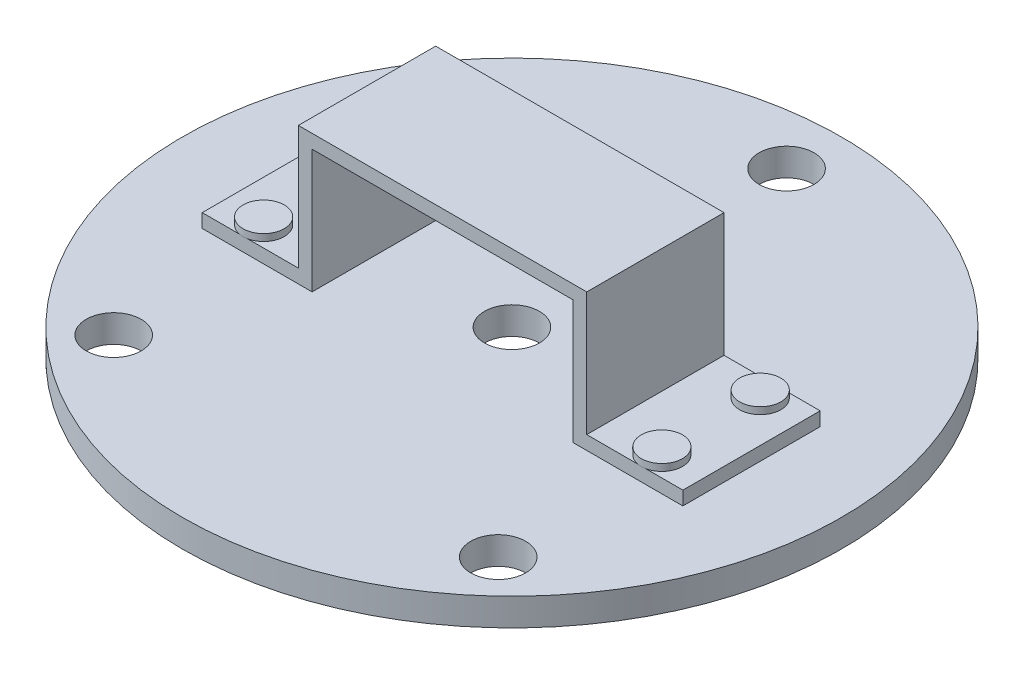
ISO-10303-21;
HEADER;
FILE_DESCRIPTION(('STEP AP214'),'2;1');
FILE_NAME('part.step','',(''),(''),'','','');
FILE_SCHEMA(('AUTOMOTIVE_DESIGN { 1 0 10303 214 1 1 1 1 }'));
ENDSEC;
DATA;
#1=APPLICATION_CONTEXT('core data for automotive mechanical design processes');
#2=APPLICATION_PROTOCOL_DEFINITION('international standard','automotive_design',2000,#1);
#3=PRODUCT_CONTEXT('',#1,'mechanical');
#4=PRODUCT('Part','Part','',(#3));
#5=PRODUCT_RELATED_PRODUCT_CATEGORY('part','',(#4));
#6=PRODUCT_DEFINITION_FORMATION('','',#4);
#7=PRODUCT_DEFINITION_CONTEXT('part definition',#1,'design');
#8=PRODUCT_DEFINITION('design','',#6,#7);
#9=PRODUCT_DEFINITION_SHAPE('','',#8);
#10=(LENGTH_UNIT() NAMED_UNIT(*) SI_UNIT(.MILLI.,.METRE.));
#11=(NAMED_UNIT(*) PLANE_ANGLE_UNIT() SI_UNIT($,.RADIAN.));
#12=(NAMED_UNIT(*) SI_UNIT($,.STERADIAN.) SOLID_ANGLE_UNIT());
#13=UNCERTAINTY_MEASURE_WITH_UNIT(LENGTH_MEASURE(1.E-05),#10,'distance_accuracy_value','');
#14=(GEOMETRIC_REPRESENTATION_CONTEXT(3) GLOBAL_UNCERTAINTY_ASSIGNED_CONTEXT((#13)) GLOBAL_UNIT_ASSIGNED_CONTEXT((#10,
#11,#12)) REPRESENTATION_CONTEXT('',''));
#15=CARTESIAN_POINT('',(0.,0.,0.));
#16=DIRECTION('',(0.,0.,1.));
#17=DIRECTION('',(1.,0.,0.));
#18=AXIS2_PLACEMENT_3D('',#15,#16,#17);
#19=CARTESIAN_POINT('',(0.,10.,0.));
#20=DIRECTION('',(0.,1.,0.));
#21=DIRECTION('',(0.,0.,1.));
#22=AXIS2_PLACEMENT_3D('',#19,#20,#21);
#23=PLANE('',#22);
#24=DIRECTION('',(-1.,0.,0.));
#25=VECTOR('',#24,1.);
#26=CARTESIAN_POINT('',(87.5,10.,25.2623733122565));
#27=LINE('',#26,#25);
#28=CARTESIAN_POINT('',(87.5,10.,25.2623733122565));
#29=VERTEX_POINT('',#28);
#30=CARTESIAN_POINT('',(47.5,10.,25.2623733122565));
#31=VERTEX_POINT('',#30);
#32=EDGE_CURVE('E310',#29,#31,#27,.T.);
#33=ORIENTED_EDGE('',*,*,#32,.T.);
#34=DIRECTION('',(0.,0.,-1.));
#35=VECTOR('',#34,1.);
#36=CARTESIAN_POINT('',(47.5,10.,25.2623733122565));
#37=LINE('',#36,#35);
#38=CARTESIAN_POINT('',(47.5,10.,-24.7376266877435));
#39=VERTEX_POINT('',#38);
#40=EDGE_CURVE('E284',#31,#39,#37,.T.);
#41=ORIENTED_EDGE('',*,*,#40,.T.);
#42=DIRECTION('',(1.,0.,0.));
#43=VECTOR('',#42,1.);
#44=CARTESIAN_POINT('',(87.5,10.,-24.7376266877435));
#45=LINE('',#44,#43);
#46=CARTESIAN_POINT('',(87.5,10.,-24.7376266877435));
#47=VERTEX_POINT('',#46);
#48=EDGE_CURVE('E317',#39,#47,#45,.T.);
#49=ORIENTED_EDGE('',*,*,#48,.T.);
#50=DIRECTION('',(0.,0.,1.));
#51=VECTOR('',#50,1.);
#52=CARTESIAN_POINT('',(87.5,10.,25.2623733122565));
#53=LINE('',#52,#51);
#54=EDGE_CURVE('E332',#47,#29,#53,.T.);
#55=ORIENTED_EDGE('',*,*,#54,.T.);
#56=EDGE_LOOP('',(#33,#41,#49,#55));
#57=FACE_BOUND('',#56,.T.);
#58=CARTESIAN_POINT('',(0.,10.,-100.));
#59=DIRECTION('',(0.,1.,0.));
#60=DIRECTION('',(0.,0.,1.));
#61=AXIS2_PLACEMENT_3D('',#58,#59,#60);
#62=CIRCLE('',#61,10.);
#63=CARTESIAN_POINT('',(0.,10.,-90.));
#64=VERTEX_POINT('',#63);
#65=EDGE_CURVE('E382',#64,#64,#62,.T.);
#66=ORIENTED_EDGE('',*,*,#65,.F.);
#67=EDGE_LOOP('',(#66));
#68=FACE_BOUND('',#67,.T.);
#69=CARTESIAN_POINT('',(-70.,10.,75.));
#70=DIRECTION('',(0.,1.,0.));
#71=DIRECTION('',(0.,0.,1.));
#72=AXIS2_PLACEMENT_3D('',#69,#70,#71);
#73=CIRCLE('',#72,10.);
#74=CARTESIAN_POINT('',(-70.,10.,85.));
#75=VERTEX_POINT('',#74);
#76=EDGE_CURVE('E390',#75,#75,#73,.T.);
#77=ORIENTED_EDGE('',*,*,#76,.F.);
#78=EDGE_LOOP('',(#77));
#79=FACE_BOUND('',#78,.T.);
#80=CARTESIAN_POINT('',(70.,10.,75.));
#81=DIRECTION('',(0.,1.,0.));
#82=DIRECTION('',(0.,0.,-1.));
#83=AXIS2_PLACEMENT_3D('',#80,#81,#82);
#84=CIRCLE('',#83,10.);
#85=CARTESIAN_POINT('',(70.,10.,65.));
#86=VERTEX_POINT('',#85);
#87=EDGE_CURVE('E376',#86,#86,#84,.T.);
#88=ORIENTED_EDGE('',*,*,#87,.F.);
#89=EDGE_LOOP('',(#88));
#90=FACE_BOUND('',#89,.T.);
#91=CARTESIAN_POINT('',(0.,10.,0.));
#92=DIRECTION('',(0.,1.,0.));
#93=DIRECTION('',(0.,0.,1.));
#94=AXIS2_PLACEMENT_3D('',#91,#92,#93);
#95=CIRCLE('',#94,10.);
#96=CARTESIAN_POINT('',(0.,10.,10.));
#97=VERTEX_POINT('',#96);
#98=EDGE_CURVE('E404',#97,#97,#95,.T.);
#99=ORIENTED_EDGE('',*,*,#98,.F.);
#100=EDGE_LOOP('',(#99));
#101=FACE_BOUND('',#100,.T.);
#102=CARTESIAN_POINT('',(0.,10.,0.));
#103=DIRECTION('',(0.,1.,0.));
#104=DIRECTION('',(0.,0.,1.));
#105=AXIS2_PLACEMENT_3D('',#102,#103,#104);
#106=CIRCLE('',#105,120.);
#107=CARTESIAN_POINT('',(0.,10.,120.));
#108=VERTEX_POINT('',#107);
#109=EDGE_CURVE('E11',#108,#108,#106,.T.);
#110=ORIENTED_EDGE('',*,*,#109,.T.);
#111=EDGE_LOOP('',(#110));
#112=FACE_BOUND('',#111,.T.);
#113=DIRECTION('',(0.,0.,-1.));
#114=VECTOR('',#113,1.);
#115=CARTESIAN_POINT('',(-47.5,10.,25.2623733122565));
#116=LINE('',#115,#114);
#117=CARTESIAN_POINT('',(-47.5,10.,25.2623733122565));
#118=VERTEX_POINT('',#117);
#119=CARTESIAN_POINT('',(-47.5,10.,-24.7376266877435));
#120=VERTEX_POINT('',#119);
#121=EDGE_CURVE('E297',#118,#120,#116,.T.);
#122=ORIENTED_EDGE('',*,*,#121,.F.);
#123=DIRECTION('',(1.,0.,0.));
#124=VECTOR('',#123,1.);
#125=CARTESIAN_POINT('',(-87.5,10.,25.2623733122565));
#126=LINE('',#125,#124);
#127=CARTESIAN_POINT('',(-87.5,10.,25.2623733122565));
#128=VERTEX_POINT('',#127);
#129=EDGE_CURVE('E350',#128,#118,#126,.T.);
#130=ORIENTED_EDGE('',*,*,#129,.F.);
#131=DIRECTION('',(0.,0.,1.));
#132=VECTOR('',#131,1.);
#133=CARTESIAN_POINT('',(-87.5,10.,25.2623733122565));
#134=LINE('',#133,#132);
#135=CARTESIAN_POINT('',(-87.5,10.,-24.7376266877435));
#136=VERTEX_POINT('',#135);
#137=EDGE_CURVE('E364',#136,#128,#134,.T.);
#138=ORIENTED_EDGE('',*,*,#137,.F.);
#139=DIRECTION('',(-1.,0.,0.));
#140=VECTOR('',#139,1.);
#141=CARTESIAN_POINT('',(-87.5,10.,-24.7376266877435));
#142=LINE('',#141,#140);
#143=EDGE_CURVE('E344',#120,#136,#142,.T.);
#144=ORIENTED_EDGE('',*,*,#143,.F.);
#145=EDGE_LOOP('',(#122,#130,#138,#144));
#146=FACE_BOUND('',#145,.T.);
#147=ADVANCED_FACE('F41',(#57,#68,#79,#90,#101,#112,#146),#23,.T.);
#148=CARTESIAN_POINT('',(0.,10.,0.));
#149=DIRECTION('',(0.,-1.,0.));
#150=DIRECTION('',(0.,0.,-1.));
#151=AXIS2_PLACEMENT_3D('',#148,#149,#150);
#152=CYLINDRICAL_SURFACE('',#151,120.);
#153=ORIENTED_EDGE('',*,*,#109,.F.);
#154=EDGE_LOOP('',(#153));
#155=FACE_BOUND('',#154,.T.);
#156=CARTESIAN_POINT('',(0.,0.,0.));
#157=DIRECTION('',(0.,1.,0.));
#158=DIRECTION('',(0.,0.,1.));
#159=AXIS2_PLACEMENT_3D('',#156,#157,#158);
#160=CIRCLE('',#159,120.);
#161=CARTESIAN_POINT('',(0.,0.,120.));
#162=VERTEX_POINT('',#161);
#163=EDGE_CURVE('E51',#162,#162,#160,.T.);
#164=ORIENTED_EDGE('',*,*,#163,.T.);
#165=EDGE_LOOP('',(#164));
#166=FACE_BOUND('',#165,.T.);
#167=ADVANCED_FACE('F43',(#155,#166),#152,.T.);
#168=CARTESIAN_POINT('',(0.,0.,0.));
#169=DIRECTION('',(0.,1.,0.));
#170=DIRECTION('',(0.,0.,1.));
#171=AXIS2_PLACEMENT_3D('',#168,#169,#170);
#172=PLANE('',#171);
#173=CARTESIAN_POINT('',(72.5,0.,-17.9048537648717));
#174=DIRECTION('',(0.,-1.,0.));
#175=DIRECTION('',(0.,0.,1.));
#176=AXIS2_PLACEMENT_3D('',#173,#174,#175);
#177=CIRCLE('',#176,5.);
#178=CARTESIAN_POINT('',(72.5,0.,-12.9048537648717));
#179=VERTEX_POINT('',#178);
#180=EDGE_CURVE('E230',#179,#179,#177,.T.);
#181=ORIENTED_EDGE('',*,*,#180,.F.);
#182=EDGE_LOOP('',(#181));
#183=FACE_BOUND('',#182,.T.);
#184=CARTESIAN_POINT('',(72.5,0.,16.9706874814871));
#185=DIRECTION('',(0.,-1.,0.));
#186=DIRECTION('',(0.,0.,1.));
#187=AXIS2_PLACEMENT_3D('',#184,#185,#186);
#188=CIRCLE('',#187,5.);
#189=CARTESIAN_POINT('',(72.5,0.,21.9706874814871));
#190=VERTEX_POINT('',#189);
#191=EDGE_CURVE('E229',#190,#190,#188,.T.);
#192=ORIENTED_EDGE('',*,*,#191,.F.);
#193=EDGE_LOOP('',(#192));
#194=FACE_BOUND('',#193,.T.);
#195=CARTESIAN_POINT('',(-72.5,0.,-17.9048537648717));
#196=DIRECTION('',(0.,1.,0.));
#197=DIRECTION('',(0.,0.,1.));
#198=AXIS2_PLACEMENT_3D('',#195,#196,#197);
#199=CIRCLE('',#198,5.);
#200=CARTESIAN_POINT('',(-72.5,0.,-12.9048537648717));
#201=VERTEX_POINT('',#200);
#202=EDGE_CURVE('E238',#201,#201,#199,.T.);
#203=ORIENTED_EDGE('',*,*,#202,.T.);
#204=EDGE_LOOP('',(#203));
#205=FACE_BOUND('',#204,.T.);
#206=CARTESIAN_POINT('',(-72.5,0.,16.9706874814871));
#207=DIRECTION('',(0.,1.,0.));
#208=DIRECTION('',(0.,0.,1.));
#209=AXIS2_PLACEMENT_3D('',#206,#207,#208);
#210=CIRCLE('',#209,5.);
#211=CARTESIAN_POINT('',(-72.5,0.,21.9706874814871));
#212=VERTEX_POINT('',#211);
#213=EDGE_CURVE('E234',#212,#212,#210,.T.);
#214=ORIENTED_EDGE('',*,*,#213,.T.);
#215=EDGE_LOOP('',(#214));
#216=FACE_BOUND('',#215,.T.);
#217=CARTESIAN_POINT('',(0.,0.,-100.));
#218=DIRECTION('',(0.,1.,0.));
#219=DIRECTION('',(0.,0.,1.));
#220=AXIS2_PLACEMENT_3D('',#217,#218,#219);
#221=CIRCLE('',#220,10.);
#222=CARTESIAN_POINT('',(0.,0.,-90.));
#223=VERTEX_POINT('',#222);
#224=EDGE_CURVE('E377',#223,#223,#221,.T.);
#225=ORIENTED_EDGE('',*,*,#224,.T.);
#226=EDGE_LOOP('',(#225));
#227=FACE_BOUND('',#226,.T.);
#228=CARTESIAN_POINT('',(-70.,0.,75.));
#229=DIRECTION('',(0.,1.,0.));
#230=DIRECTION('',(0.,0.,1.));
#231=AXIS2_PLACEMENT_3D('',#228,#229,#230);
#232=CIRCLE('',#231,10.);
#233=CARTESIAN_POINT('',(-70.,0.,85.));
#234=VERTEX_POINT('',#233);
#235=EDGE_CURVE('E386',#234,#234,#232,.T.);
#236=ORIENTED_EDGE('',*,*,#235,.T.);
#237=EDGE_LOOP('',(#236));
#238=FACE_BOUND('',#237,.T.);
#239=CARTESIAN_POINT('',(70.,0.,75.));
#240=DIRECTION('',(0.,1.,0.));
#241=DIRECTION('',(0.,0.,-1.));
#242=AXIS2_PLACEMENT_3D('',#239,#240,#241);
#243=CIRCLE('',#242,10.);
#244=CARTESIAN_POINT('',(70.,0.,65.));
#245=VERTEX_POINT('',#244);
#246=EDGE_CURVE('E394',#245,#245,#243,.T.);
#247=ORIENTED_EDGE('',*,*,#246,.T.);
#248=EDGE_LOOP('',(#247));
#249=FACE_BOUND('',#248,.T.);
#250=CARTESIAN_POINT('',(0.,0.,0.));
#251=DIRECTION('',(0.,1.,0.));
#252=DIRECTION('',(0.,0.,1.));
#253=AXIS2_PLACEMENT_3D('',#250,#251,#252);
#254=CIRCLE('',#253,10.);
#255=CARTESIAN_POINT('',(0.,0.,10.));
#256=VERTEX_POINT('',#255);
#257=EDGE_CURVE('E381',#256,#256,#254,.T.);
#258=ORIENTED_EDGE('',*,*,#257,.T.);
#259=EDGE_LOOP('',(#258));
#260=FACE_BOUND('',#259,.T.);
#261=ORIENTED_EDGE('',*,*,#163,.F.);
#262=EDGE_LOOP('',(#261));
#263=FACE_BOUND('',#262,.T.);
#264=ADVANCED_FACE('F445',(#183,#194,#205,#216,#227,#238,#249,#260,#263),#172,.F.);
#265=CARTESIAN_POINT('',(0.,0.,0.));
#266=DIRECTION('',(0.,1.,0.));
#267=DIRECTION('',(0.,0.,1.));
#268=AXIS2_PLACEMENT_3D('',#265,#266,#267);
#269=CYLINDRICAL_SURFACE('',#268,10.);
#270=ORIENTED_EDGE('',*,*,#98,.T.);
#271=EDGE_LOOP('',(#270));
#272=FACE_BOUND('',#271,.T.);
#273=ORIENTED_EDGE('',*,*,#257,.F.);
#274=EDGE_LOOP('',(#273));
#275=FACE_BOUND('',#274,.T.);
#276=ADVANCED_FACE('F449',(#272,#275),#269,.F.);
#277=CARTESIAN_POINT('',(70.,0.,75.));
#278=DIRECTION('',(0.,1.,0.));
#279=DIRECTION('',(0.,0.,1.));
#280=AXIS2_PLACEMENT_3D('',#277,#278,#279);
#281=CYLINDRICAL_SURFACE('',#280,10.);
#282=ORIENTED_EDGE('',*,*,#246,.F.);
#283=EDGE_LOOP('',(#282));
#284=FACE_BOUND('',#283,.T.);
#285=ORIENTED_EDGE('',*,*,#87,.T.);
#286=EDGE_LOOP('',(#285));
#287=FACE_BOUND('',#286,.T.);
#288=ADVANCED_FACE('F457',(#284,#287),#281,.F.);
#289=CARTESIAN_POINT('',(-70.,0.,75.));
#290=DIRECTION('',(0.,1.,0.));
#291=DIRECTION('',(0.,0.,1.));
#292=AXIS2_PLACEMENT_3D('',#289,#290,#291);
#293=CYLINDRICAL_SURFACE('',#292,10.);
#294=ORIENTED_EDGE('',*,*,#235,.F.);
#295=EDGE_LOOP('',(#294));
#296=FACE_BOUND('',#295,.T.);
#297=ORIENTED_EDGE('',*,*,#76,.T.);
#298=EDGE_LOOP('',(#297));
#299=FACE_BOUND('',#298,.T.);
#300=ADVANCED_FACE('F480',(#296,#299),#293,.F.);
#301=CARTESIAN_POINT('',(0.,0.,-100.));
#302=DIRECTION('',(0.,1.,0.));
#303=DIRECTION('',(0.,0.,1.));
#304=AXIS2_PLACEMENT_3D('',#301,#302,#303);
#305=CYLINDRICAL_SURFACE('',#304,10.);
#306=ORIENTED_EDGE('',*,*,#224,.F.);
#307=EDGE_LOOP('',(#306));
#308=FACE_BOUND('',#307,.T.);
#309=ORIENTED_EDGE('',*,*,#65,.T.);
#310=EDGE_LOOP('',(#309));
#311=FACE_BOUND('',#310,.T.);
#312=ADVANCED_FACE('F574',(#308,#311),#305,.F.);
#313=CARTESIAN_POINT('',(-87.5,15.,-24.7376266877435));
#314=DIRECTION('',(0.,0.,1.));
#315=DIRECTION('',(1.,0.,0.));
#316=AXIS2_PLACEMENT_3D('',#313,#314,#315);
#317=PLANE('',#316);
#318=ORIENTED_EDGE('',*,*,#143,.T.);
#319=DIRECTION('',(0.,-1.,0.));
#320=VECTOR('',#319,1.);
#321=CARTESIAN_POINT('',(-87.5,15.,-24.7376266877435));
#322=LINE('',#321,#320);
#323=CARTESIAN_POINT('',(-87.5,15.,-24.7376266877435));
#324=VERTEX_POINT('',#323);
#325=EDGE_CURVE('E372',#324,#136,#322,.T.);
#326=ORIENTED_EDGE('',*,*,#325,.F.);
#327=DIRECTION('',(-1.,0.,0.));
#328=VECTOR('',#327,1.);
#329=CARTESIAN_POINT('',(-87.5,15.,-24.7376266877435));
#330=LINE('',#329,#328);
#331=CARTESIAN_POINT('',(-75.5924446938418,15.,-24.7376266877435));
#332=VERTEX_POINT('',#331);
#333=EDGE_CURVE('E349',#332,#324,#330,.T.);
#334=ORIENTED_EDGE('',*,*,#333,.F.);
#335=DIRECTION('',(-1.,0.,0.));
#336=VECTOR('',#335,1.);
#337=CARTESIAN_POINT('',(-87.5,15.,-24.7376266877435));
#338=LINE('',#337,#336);
#339=CARTESIAN_POINT('',(-69.4075553061582,15.,-24.7376266877435));
#340=VERTEX_POINT('',#339);
#341=EDGE_CURVE('E221',#340,#332,#338,.T.);
#342=ORIENTED_EDGE('',*,*,#341,.F.);
#343=CARTESIAN_POINT('',(-52.5,15.,-24.7376266877435));
#344=VERTEX_POINT('',#343);
#345=EDGE_CURVE('E351',#344,#340,#330,.T.);
#346=ORIENTED_EDGE('',*,*,#345,.F.);
#347=DIRECTION('',(0.,1.,0.));
#348=VECTOR('',#347,1.);
#349=CARTESIAN_POINT('',(-52.5,10.,-24.7376266877435));
#350=LINE('',#349,#348);
#351=CARTESIAN_POINT('',(-52.5,60.,-24.7376266877435));
#352=VERTEX_POINT('',#351);
#353=EDGE_CURVE('E298',#344,#352,#350,.T.);
#354=ORIENTED_EDGE('',*,*,#353,.T.);
#355=DIRECTION('',(-1.,0.,0.));
#356=VECTOR('',#355,1.);
#357=CARTESIAN_POINT('',(-52.5,60.,-24.7376266877435));
#358=LINE('',#357,#356);
#359=CARTESIAN_POINT('',(52.5,60.,-24.7376266877435));
#360=VERTEX_POINT('',#359);
#361=EDGE_CURVE('E259',#360,#352,#358,.T.);
#362=ORIENTED_EDGE('',*,*,#361,.F.);
#363=DIRECTION('',(0.,1.,0.));
#364=VECTOR('',#363,1.);
#365=CARTESIAN_POINT('',(52.5,10.,-24.7376266877435));
#366=LINE('',#365,#364);
#367=CARTESIAN_POINT('',(52.5,15.,-24.7376266877435));
#368=VERTEX_POINT('',#367);
#369=EDGE_CURVE('E276',#368,#360,#366,.T.);
#370=ORIENTED_EDGE('',*,*,#369,.F.);
#371=DIRECTION('',(1.,0.,0.));
#372=VECTOR('',#371,1.);
#373=CARTESIAN_POINT('',(87.5,15.,-24.7376266877435));
#374=LINE('',#373,#372);
#375=CARTESIAN_POINT('',(69.4075553061582,15.,-24.7376266877435));
#376=VERTEX_POINT('',#375);
#377=EDGE_CURVE('E325',#368,#376,#374,.T.);
#378=ORIENTED_EDGE('',*,*,#377,.T.);
#379=DIRECTION('',(-1.,0.,0.));
#380=VECTOR('',#379,1.);
#381=CARTESIAN_POINT('',(-87.5,15.,-24.7376266877435));
#382=LINE('',#381,#380);
#383=CARTESIAN_POINT('',(75.5924446938418,15.,-24.7376266877435));
#384=VERTEX_POINT('',#383);
#385=EDGE_CURVE('E200',#384,#376,#382,.T.);
#386=ORIENTED_EDGE('',*,*,#385,.F.);
#387=CARTESIAN_POINT('',(87.5,15.,-24.7376266877435));
#388=VERTEX_POINT('',#387);
#389=EDGE_CURVE('E324',#384,#388,#374,.T.);
#390=ORIENTED_EDGE('',*,*,#389,.T.);
#391=DIRECTION('',(0.,-1.,0.));
#392=VECTOR('',#391,1.);
#393=CARTESIAN_POINT('',(87.5,15.,-24.7376266877435));
#394=LINE('',#393,#392);
#395=EDGE_CURVE('E329',#388,#47,#394,.T.);
#396=ORIENTED_EDGE('',*,*,#395,.T.);
#397=ORIENTED_EDGE('',*,*,#48,.F.);
#398=DIRECTION('',(0.,1.,0.));
#399=VECTOR('',#398,1.);
#400=CARTESIAN_POINT('',(47.5,10.,-24.7376266877435));
#401=LINE('',#400,#399);
#402=CARTESIAN_POINT('',(47.5,55.,-24.7376266877435));
#403=VERTEX_POINT('',#402);
#404=EDGE_CURVE('E280',#39,#403,#401,.T.);
#405=ORIENTED_EDGE('',*,*,#404,.T.);
#406=DIRECTION('',(-1.,0.,0.));
#407=VECTOR('',#406,1.);
#408=CARTESIAN_POINT('',(-52.5,55.,-24.7376266877435));
#409=LINE('',#408,#407);
#410=CARTESIAN_POINT('',(-47.5,55.,-24.7376266877435));
#411=VERTEX_POINT('',#410);
#412=EDGE_CURVE('E251',#403,#411,#409,.T.);
#413=ORIENTED_EDGE('',*,*,#412,.T.);
#414=DIRECTION('',(0.,1.,0.));
#415=VECTOR('',#414,1.);
#416=CARTESIAN_POINT('',(-47.5,10.,-24.7376266877435));
#417=LINE('',#416,#415);
#418=EDGE_CURVE('E302',#120,#411,#417,.T.);
#419=ORIENTED_EDGE('',*,*,#418,.F.);
#420=EDGE_LOOP('',(#318,#326,#334,#342,#346,#354,#362,#370,#378,#386,#390,#396,#397,#405,#413,#419));
#421=FACE_BOUND('',#420,.T.);
#422=ADVANCED_FACE('F496',(#421),#317,.F.);
#423=CARTESIAN_POINT('',(-87.5,15.,25.2623733122565));
#424=DIRECTION('',(1.,0.,0.));
#425=DIRECTION('',(0.,0.,-1.));
#426=AXIS2_PLACEMENT_3D('',#423,#424,#425);
#427=PLANE('',#426);
#428=ORIENTED_EDGE('',*,*,#137,.T.);
#429=DIRECTION('',(0.,-1.,0.));
#430=VECTOR('',#429,1.);
#431=CARTESIAN_POINT('',(-87.5,15.,25.2623733122565));
#432=LINE('',#431,#430);
#433=CARTESIAN_POINT('',(-87.5,15.,25.2623733122565));
#434=VERTEX_POINT('',#433);
#435=EDGE_CURVE('E361',#434,#128,#432,.T.);
#436=ORIENTED_EDGE('',*,*,#435,.F.);
#437=DIRECTION('',(0.,0.,1.));
#438=VECTOR('',#437,1.);
#439=CARTESIAN_POINT('',(-87.5,15.,25.2623733122565));
#440=LINE('',#439,#438);
#441=EDGE_CURVE('E354',#324,#434,#440,.T.);
#442=ORIENTED_EDGE('',*,*,#441,.F.);
#443=ORIENTED_EDGE('',*,*,#325,.T.);
#444=EDGE_LOOP('',(#428,#436,#442,#443));
#445=FACE_BOUND('',#444,.T.);
#446=ADVANCED_FACE('F506',(#445),#427,.F.);
#447=CARTESIAN_POINT('',(-87.5,15.,25.2623733122565));
#448=DIRECTION('',(0.,0.,-1.));
#449=DIRECTION('',(-1.,0.,0.));
#450=AXIS2_PLACEMENT_3D('',#447,#448,#449);
#451=PLANE('',#450);
#452=ORIENTED_EDGE('',*,*,#129,.T.);
#453=DIRECTION('',(0.,-1.,0.));
#454=VECTOR('',#453,1.);
#455=CARTESIAN_POINT('',(-47.5,10.,25.2623733122565));
#456=LINE('',#455,#454);
#457=CARTESIAN_POINT('',(-47.5,55.,25.2623733122565));
#458=VERTEX_POINT('',#457);
#459=EDGE_CURVE('E293',#458,#118,#456,.T.);
#460=ORIENTED_EDGE('',*,*,#459,.F.);
#461=DIRECTION('',(1.,0.,0.));
#462=VECTOR('',#461,1.);
#463=CARTESIAN_POINT('',(-52.5,55.,25.2623733122565));
#464=LINE('',#463,#462);
#465=CARTESIAN_POINT('',(47.5,55.,25.2623733122565));
#466=VERTEX_POINT('',#465);
#467=EDGE_CURVE('E264',#458,#466,#464,.T.);
#468=ORIENTED_EDGE('',*,*,#467,.T.);
#469=DIRECTION('',(0.,-1.,0.));
#470=VECTOR('',#469,1.);
#471=CARTESIAN_POINT('',(47.5,10.,25.2623733122565));
#472=LINE('',#471,#470);
#473=EDGE_CURVE('E271',#466,#31,#472,.T.);
#474=ORIENTED_EDGE('',*,*,#473,.T.);
#475=ORIENTED_EDGE('',*,*,#32,.F.);
#476=DIRECTION('',(0.,-1.,0.));
#477=VECTOR('',#476,1.);
#478=CARTESIAN_POINT('',(87.5,15.,25.2623733122565));
#479=LINE('',#478,#477);
#480=CARTESIAN_POINT('',(87.5,15.,25.2623733122565));
#481=VERTEX_POINT('',#480);
#482=EDGE_CURVE('E340',#481,#29,#479,.T.);
#483=ORIENTED_EDGE('',*,*,#482,.F.);
#484=DIRECTION('',(-1.,0.,0.));
#485=VECTOR('',#484,1.);
#486=CARTESIAN_POINT('',(87.5,15.,25.2623733122565));
#487=LINE('',#486,#485);
#488=CARTESIAN_POINT('',(73.9549591437053,15.,25.2623733122565));
#489=VERTEX_POINT('',#488);
#490=EDGE_CURVE('E177',#481,#489,#487,.T.);
#491=ORIENTED_EDGE('',*,*,#490,.T.);
#492=DIRECTION('',(-1.,0.,0.));
#493=VECTOR('',#492,1.);
#494=CARTESIAN_POINT('',(-87.5,15.,25.2623733122565));
#495=LINE('',#494,#493);
#496=CARTESIAN_POINT('',(71.0450408562947,15.,25.2623733122565));
#497=VERTEX_POINT('',#496);
#498=EDGE_CURVE('E166',#489,#497,#495,.T.);
#499=ORIENTED_EDGE('',*,*,#498,.T.);
#500=CARTESIAN_POINT('',(52.5,15.,25.2623733122565));
#501=VERTEX_POINT('',#500);
#502=EDGE_CURVE('E170',#497,#501,#487,.T.);
#503=ORIENTED_EDGE('',*,*,#502,.T.);
#504=DIRECTION('',(0.,-1.,0.));
#505=VECTOR('',#504,1.);
#506=CARTESIAN_POINT('',(52.5,10.,25.2623733122565));
#507=LINE('',#506,#505);
#508=CARTESIAN_POINT('',(52.5,60.,25.2623733122565));
#509=VERTEX_POINT('',#508);
#510=EDGE_CURVE('E263',#509,#501,#507,.T.);
#511=ORIENTED_EDGE('',*,*,#510,.F.);
#512=DIRECTION('',(1.,0.,0.));
#513=VECTOR('',#512,1.);
#514=CARTESIAN_POINT('',(-52.5,60.,25.2623733122565));
#515=LINE('',#514,#513);
#516=CARTESIAN_POINT('',(-52.5,60.,25.2623733122565));
#517=VERTEX_POINT('',#516);
#518=EDGE_CURVE('E250',#517,#509,#515,.T.);
#519=ORIENTED_EDGE('',*,*,#518,.F.);
#520=DIRECTION('',(0.,-1.,0.));
#521=VECTOR('',#520,1.);
#522=CARTESIAN_POINT('',(-52.5,10.,25.2623733122565));
#523=LINE('',#522,#521);
#524=CARTESIAN_POINT('',(-52.5,15.,25.2623733122565));
#525=VERTEX_POINT('',#524);
#526=EDGE_CURVE('E288',#517,#525,#523,.T.);
#527=ORIENTED_EDGE('',*,*,#526,.T.);
#528=DIRECTION('',(1.,0.,0.));
#529=VECTOR('',#528,1.);
#530=CARTESIAN_POINT('',(-87.5,15.,25.2623733122565));
#531=LINE('',#530,#529);
#532=CARTESIAN_POINT('',(-71.0450408562947,15.,25.2623733122565));
#533=VERTEX_POINT('',#532);
#534=EDGE_CURVE('E357',#533,#525,#531,.T.);
#535=ORIENTED_EDGE('',*,*,#534,.F.);
#536=DIRECTION('',(-1.,0.,0.));
#537=VECTOR('',#536,1.);
#538=CARTESIAN_POINT('',(-87.5,15.,25.2623733122565));
#539=LINE('',#538,#537);
#540=CARTESIAN_POINT('',(-73.9549591437053,15.,25.2623733122565));
#541=VERTEX_POINT('',#540);
#542=EDGE_CURVE('E208',#533,#541,#539,.T.);
#543=ORIENTED_EDGE('',*,*,#542,.T.);
#544=EDGE_CURVE('E358',#434,#541,#531,.T.);
#545=ORIENTED_EDGE('',*,*,#544,.F.);
#546=ORIENTED_EDGE('',*,*,#435,.T.);
#547=EDGE_LOOP('',(#452,#460,#468,#474,#475,#483,#491,#499,#503,#511,#519,#527,#535,#543,#545,#546));
#548=FACE_BOUND('',#547,.T.);
#549=ADVANCED_FACE('F179',(#548),#451,.F.);
#550=CARTESIAN_POINT('',(0.,15.,0.));
#551=DIRECTION('',(0.,-1.,0.));
#552=DIRECTION('',(0.,0.,-1.));
#553=AXIS2_PLACEMENT_3D('',#550,#551,#552);
#554=PLANE('',#553);
#555=CARTESIAN_POINT('',(-72.5,15.,17.9048537648717));
#556=DIRECTION('',(0.,1.,0.));
#557=DIRECTION('',(0.,0.,-1.));
#558=AXIS2_PLACEMENT_3D('',#555,#556,#557);
#559=CIRCLE('',#558,7.50000000000001);
#560=EDGE_CURVE('E203',#533,#541,#559,.T.);
#561=ORIENTED_EDGE('',*,*,#560,.F.);
#562=ORIENTED_EDGE('',*,*,#534,.T.);
#563=DIRECTION('',(0.,0.,-1.));
#564=VECTOR('',#563,1.);
#565=CARTESIAN_POINT('',(-52.5,15.,25.2623733122565));
#566=LINE('',#565,#564);
#567=EDGE_CURVE('E345',#525,#344,#566,.T.);
#568=ORIENTED_EDGE('',*,*,#567,.T.);
#569=ORIENTED_EDGE('',*,*,#345,.T.);
#570=CARTESIAN_POINT('',(-72.5,15.,-17.9048537648717));
#571=DIRECTION('',(0.,1.,0.));
#572=DIRECTION('',(0.,0.,1.));
#573=AXIS2_PLACEMENT_3D('',#570,#571,#572);
#574=CIRCLE('',#573,7.50000000000001);
#575=EDGE_CURVE('E216',#332,#340,#574,.T.);
#576=ORIENTED_EDGE('',*,*,#575,.F.);
#577=ORIENTED_EDGE('',*,*,#333,.T.);
#578=ORIENTED_EDGE('',*,*,#441,.T.);
#579=ORIENTED_EDGE('',*,*,#544,.T.);
#580=EDGE_LOOP('',(#561,#562,#568,#569,#576,#577,#578,#579));
#581=FACE_BOUND('',#580,.T.);
#582=ADVANCED_FACE('F565',(#581),#554,.F.);
#583=CARTESIAN_POINT('',(87.5,15.,25.2623733122565));
#584=DIRECTION('',(1.,0.,0.));
#585=DIRECTION('',(0.,0.,-1.));
#586=AXIS2_PLACEMENT_3D('',#583,#584,#585);
#587=PLANE('',#586);
#588=ORIENTED_EDGE('',*,*,#54,.F.);
#589=ORIENTED_EDGE('',*,*,#395,.F.);
#590=DIRECTION('',(0.,0.,1.));
#591=VECTOR('',#590,1.);
#592=CARTESIAN_POINT('',(87.5,15.,25.2623733122565));
#593=LINE('',#592,#591);
#594=EDGE_CURVE('E320',#388,#481,#593,.T.);
#595=ORIENTED_EDGE('',*,*,#594,.T.);
#596=ORIENTED_EDGE('',*,*,#482,.T.);
#597=EDGE_LOOP('',(#588,#589,#595,#596));
#598=FACE_BOUND('',#597,.T.);
#599=ADVANCED_FACE('F538',(#598),#587,.T.);
#600=CARTESIAN_POINT('',(0.,15.,0.));
#601=DIRECTION('',(0.,-1.,0.));
#602=DIRECTION('',(0.,0.,-1.));
#603=AXIS2_PLACEMENT_3D('',#600,#601,#602);
#604=PLANE('',#603);
#605=ORIENTED_EDGE('',*,*,#502,.F.);
#606=CARTESIAN_POINT('',(72.5,15.,17.9048537648717));
#607=DIRECTION('',(0.,-1.,0.));
#608=DIRECTION('',(0.,0.,-1.));
#609=AXIS2_PLACEMENT_3D('',#606,#607,#608);
#610=CIRCLE('',#609,7.50000000000001);
#611=EDGE_CURVE('E155',#497,#489,#610,.T.);
#612=ORIENTED_EDGE('',*,*,#611,.T.);
#613=ORIENTED_EDGE('',*,*,#490,.F.);
#614=ORIENTED_EDGE('',*,*,#594,.F.);
#615=ORIENTED_EDGE('',*,*,#389,.F.);
#616=CARTESIAN_POINT('',(72.5,15.,-17.9048537648717));
#617=DIRECTION('',(0.,-1.,0.));
#618=DIRECTION('',(0.,0.,1.));
#619=AXIS2_PLACEMENT_3D('',#616,#617,#618);
#620=CIRCLE('',#619,7.50000000000001);
#621=EDGE_CURVE('E181',#384,#376,#620,.T.);
#622=ORIENTED_EDGE('',*,*,#621,.T.);
#623=ORIENTED_EDGE('',*,*,#377,.F.);
#624=DIRECTION('',(0.,0.,-1.));
#625=VECTOR('',#624,1.);
#626=CARTESIAN_POINT('',(52.5,15.,25.2623733122565));
#627=LINE('',#626,#625);
#628=EDGE_CURVE('E173',#501,#368,#627,.T.);
#629=ORIENTED_EDGE('',*,*,#628,.F.);
#630=EDGE_LOOP('',(#605,#612,#613,#614,#615,#622,#623,#629));
#631=FACE_BOUND('',#630,.T.);
#632=ADVANCED_FACE('F171',(#631),#604,.F.);
#633=CARTESIAN_POINT('',(-52.5,0.,0.));
#634=DIRECTION('',(-1.,0.,0.));
#635=DIRECTION('',(0.,0.,1.));
#636=AXIS2_PLACEMENT_3D('',#633,#634,#635);
#637=PLANE('',#636);
#638=ORIENTED_EDGE('',*,*,#567,.F.);
#639=ORIENTED_EDGE('',*,*,#526,.F.);
#640=DIRECTION('',(0.,0.,1.));
#641=VECTOR('',#640,1.);
#642=CARTESIAN_POINT('',(-52.5,60.,-24.7376266877435));
#643=LINE('',#642,#641);
#644=EDGE_CURVE('E246',#352,#517,#643,.T.);
#645=ORIENTED_EDGE('',*,*,#644,.F.);
#646=ORIENTED_EDGE('',*,*,#353,.F.);
#647=EDGE_LOOP('',(#638,#639,#645,#646));
#648=FACE_BOUND('',#647,.T.);
#649=ADVANCED_FACE('F557',(#648),#637,.T.);
#650=CARTESIAN_POINT('',(-47.5,0.,0.));
#651=DIRECTION('',(-1.,0.,0.));
#652=DIRECTION('',(0.,0.,1.));
#653=AXIS2_PLACEMENT_3D('',#650,#651,#652);
#654=PLANE('',#653);
#655=ORIENTED_EDGE('',*,*,#459,.T.);
#656=ORIENTED_EDGE('',*,*,#121,.T.);
#657=ORIENTED_EDGE('',*,*,#418,.T.);
#658=DIRECTION('',(0.,0.,1.));
#659=VECTOR('',#658,1.);
#660=CARTESIAN_POINT('',(-47.5,55.,25.2623733122565));
#661=LINE('',#660,#659);
#662=EDGE_CURVE('E306',#411,#458,#661,.T.);
#663=ORIENTED_EDGE('',*,*,#662,.T.);
#664=EDGE_LOOP('',(#655,#656,#657,#663));
#665=FACE_BOUND('',#664,.T.);
#666=ADVANCED_FACE('F493',(#665),#654,.F.);
#667=CARTESIAN_POINT('',(52.5,0.,0.));
#668=DIRECTION('',(1.,0.,0.));
#669=DIRECTION('',(0.,0.,1.));
#670=AXIS2_PLACEMENT_3D('',#667,#668,#669);
#671=PLANE('',#670);
#672=ORIENTED_EDGE('',*,*,#628,.T.);
#673=ORIENTED_EDGE('',*,*,#369,.T.);
#674=DIRECTION('',(0.,0.,-1.));
#675=VECTOR('',#674,1.);
#676=CARTESIAN_POINT('',(52.5,60.,-24.7376266877435));
#677=LINE('',#676,#675);
#678=EDGE_CURVE('E255',#509,#360,#677,.T.);
#679=ORIENTED_EDGE('',*,*,#678,.F.);
#680=ORIENTED_EDGE('',*,*,#510,.T.);
#681=EDGE_LOOP('',(#672,#673,#679,#680));
#682=FACE_BOUND('',#681,.T.);
#683=ADVANCED_FACE('F544',(#682),#671,.T.);
#684=CARTESIAN_POINT('',(47.5,0.,0.));
#685=DIRECTION('',(1.,0.,0.));
#686=DIRECTION('',(0.,0.,1.));
#687=AXIS2_PLACEMENT_3D('',#684,#685,#686);
#688=PLANE('',#687);
#689=ORIENTED_EDGE('',*,*,#473,.F.);
#690=DIRECTION('',(0.,0.,1.));
#691=VECTOR('',#690,1.);
#692=CARTESIAN_POINT('',(47.5,55.,25.2623733122565));
#693=LINE('',#692,#691);
#694=EDGE_CURVE('E275',#403,#466,#693,.T.);
#695=ORIENTED_EDGE('',*,*,#694,.F.);
#696=ORIENTED_EDGE('',*,*,#404,.F.);
#697=ORIENTED_EDGE('',*,*,#40,.F.);
#698=EDGE_LOOP('',(#689,#695,#696,#697));
#699=FACE_BOUND('',#698,.T.);
#700=ADVANCED_FACE('F542',(#699),#688,.F.);
#701=CARTESIAN_POINT('',(0.,55.,0.));
#702=DIRECTION('',(0.,1.,0.));
#703=DIRECTION('',(0.,0.,1.));
#704=AXIS2_PLACEMENT_3D('',#701,#702,#703);
#705=PLANE('',#704);
#706=ORIENTED_EDGE('',*,*,#662,.F.);
#707=ORIENTED_EDGE('',*,*,#412,.F.);
#708=ORIENTED_EDGE('',*,*,#694,.T.);
#709=ORIENTED_EDGE('',*,*,#467,.F.);
#710=EDGE_LOOP('',(#706,#707,#708,#709));
#711=FACE_BOUND('',#710,.T.);
#712=ADVANCED_FACE('F501',(#711),#705,.F.);
#713=CARTESIAN_POINT('',(0.,60.,0.));
#714=DIRECTION('',(0.,1.,0.));
#715=DIRECTION('',(0.,0.,1.));
#716=AXIS2_PLACEMENT_3D('',#713,#714,#715);
#717=PLANE('',#716);
#718=ORIENTED_EDGE('',*,*,#644,.T.);
#719=ORIENTED_EDGE('',*,*,#518,.T.);
#720=ORIENTED_EDGE('',*,*,#678,.T.);
#721=ORIENTED_EDGE('',*,*,#361,.T.);
#722=EDGE_LOOP('',(#718,#719,#720,#721));
#723=FACE_BOUND('',#722,.T.);
#724=ADVANCED_FACE('F433',(#723),#717,.T.);
#725=CARTESIAN_POINT('',(-72.5,0.,16.9706874814871));
#726=DIRECTION('',(0.,1.,0.));
#727=DIRECTION('',(0.,0.,1.));
#728=AXIS2_PLACEMENT_3D('',#725,#726,#727);
#729=CYLINDRICAL_SURFACE('',#728,5.);
#730=ORIENTED_EDGE('',*,*,#213,.F.);
#731=EDGE_LOOP('',(#730));
#732=FACE_BOUND('',#731,.T.);
#733=CARTESIAN_POINT('',(-72.5,15.,16.9706874814871));
#734=DIRECTION('',(0.,-1.,0.));
#735=DIRECTION('',(0.,0.,-1.));
#736=AXIS2_PLACEMENT_3D('',#733,#734,#735);
#737=CIRCLE('',#736,5.);
#738=CARTESIAN_POINT('',(-72.5,15.,11.9706874814871));
#739=VERTEX_POINT('',#738);
#740=EDGE_CURVE('E242',#739,#739,#737,.T.);
#741=ORIENTED_EDGE('',*,*,#740,.F.);
#742=EDGE_LOOP('',(#741));
#743=FACE_BOUND('',#742,.T.);
#744=ADVANCED_FACE('F423',(#732,#743),#729,.F.);
#745=CARTESIAN_POINT('',(-72.5,0.,-17.9048537648717));
#746=DIRECTION('',(0.,1.,0.));
#747=DIRECTION('',(0.,0.,1.));
#748=AXIS2_PLACEMENT_3D('',#745,#746,#747);
#749=CYLINDRICAL_SURFACE('',#748,5.);
#750=ORIENTED_EDGE('',*,*,#202,.F.);
#751=EDGE_LOOP('',(#750));
#752=FACE_BOUND('',#751,.T.);
#753=CARTESIAN_POINT('',(-72.5,15.,-17.9048537648717));
#754=DIRECTION('',(0.,-1.,0.));
#755=DIRECTION('',(0.,0.,-1.));
#756=AXIS2_PLACEMENT_3D('',#753,#754,#755);
#757=CIRCLE('',#756,5.);
#758=CARTESIAN_POINT('',(-72.5,15.,-22.9048537648717));
#759=VERTEX_POINT('',#758);
#760=EDGE_CURVE('E45',#759,#759,#757,.T.);
#761=ORIENTED_EDGE('',*,*,#760,.F.);
#762=EDGE_LOOP('',(#761));
#763=FACE_BOUND('',#762,.T.);
#764=ADVANCED_FACE('F420',(#752,#763),#749,.F.);
#765=CARTESIAN_POINT('',(72.5,0.,16.9706874814871));
#766=DIRECTION('',(0.,1.,0.));
#767=DIRECTION('',(0.,0.,1.));
#768=AXIS2_PLACEMENT_3D('',#765,#766,#767);
#769=CYLINDRICAL_SURFACE('',#768,5.);
#770=ORIENTED_EDGE('',*,*,#191,.T.);
#771=EDGE_LOOP('',(#770));
#772=FACE_BOUND('',#771,.T.);
#773=CARTESIAN_POINT('',(72.5,15.,16.9706874814871));
#774=DIRECTION('',(0.,-1.,0.));
#775=DIRECTION('',(0.,0.,-1.));
#776=AXIS2_PLACEMENT_3D('',#773,#774,#775);
#777=CIRCLE('',#776,5.);
#778=CARTESIAN_POINT('',(72.5,15.,11.9706874814871));
#779=VERTEX_POINT('',#778);
#780=EDGE_CURVE('E182',#779,#779,#777,.T.);
#781=ORIENTED_EDGE('',*,*,#780,.F.);
#782=EDGE_LOOP('',(#781));
#783=FACE_BOUND('',#782,.T.);
#784=ADVANCED_FACE('F422',(#772,#783),#769,.F.);
#785=CARTESIAN_POINT('',(72.5,0.,-17.9048537648717));
#786=DIRECTION('',(0.,1.,0.));
#787=DIRECTION('',(0.,0.,1.));
#788=AXIS2_PLACEMENT_3D('',#785,#786,#787);
#789=CYLINDRICAL_SURFACE('',#788,5.);
#790=ORIENTED_EDGE('',*,*,#180,.T.);
#791=EDGE_LOOP('',(#790));
#792=FACE_BOUND('',#791,.T.);
#793=CARTESIAN_POINT('',(72.5,15.,-17.9048537648717));
#794=DIRECTION('',(0.,1.,0.));
#795=DIRECTION('',(0.,0.,1.));
#796=AXIS2_PLACEMENT_3D('',#793,#794,#795);
#797=CIRCLE('',#796,5.);
#798=CARTESIAN_POINT('',(72.5,15.,-12.9048537648717));
#799=VERTEX_POINT('',#798);
#800=EDGE_CURVE('E194',#799,#799,#797,.T.);
#801=ORIENTED_EDGE('',*,*,#800,.T.);
#802=EDGE_LOOP('',(#801));
#803=FACE_BOUND('',#802,.T.);
#804=ADVANCED_FACE('F430',(#792,#803),#789,.F.);
#805=CARTESIAN_POINT('',(-72.5,15.,-17.9048537648717));
#806=DIRECTION('',(0.,1.,0.));
#807=DIRECTION('',(0.,0.,1.));
#808=AXIS2_PLACEMENT_3D('',#805,#806,#807);
#809=PLANE('',#808);
#810=ORIENTED_EDGE('',*,*,#760,.T.);
#811=EDGE_LOOP('',(#810));
#812=FACE_BOUND('',#811,.T.);
#813=ADVANCED_FACE('F418',(#812),#809,.F.);
#814=EDGE_CURVE('E222',#340,#332,#574,.T.);
#815=ORIENTED_EDGE('',*,*,#814,.F.);
#816=ORIENTED_EDGE('',*,*,#341,.T.);
#817=EDGE_LOOP('',(#815,#816));
#818=FACE_BOUND('',#817,.T.);
#819=ADVANCED_FACE('F515',(#818),#809,.F.);
#820=CARTESIAN_POINT('',(-72.5,17.5,-17.9048537648717));
#821=DIRECTION('',(0.,-1.,0.));
#822=DIRECTION('',(0.,0.,-1.));
#823=AXIS2_PLACEMENT_3D('',#820,#821,#822);
#824=CYLINDRICAL_SURFACE('',#823,7.50000000000001);
#825=CARTESIAN_POINT('',(-72.5,17.5,-17.9048537648717));
#826=DIRECTION('',(0.,1.,0.));
#827=DIRECTION('',(0.,0.,1.));
#828=AXIS2_PLACEMENT_3D('',#825,#826,#827);
#829=CIRCLE('',#828,7.50000000000001);
#830=CARTESIAN_POINT('',(-72.5,17.5,-10.4048537648717));
#831=VERTEX_POINT('',#830);
#832=EDGE_CURVE('E217',#831,#831,#829,.T.);
#833=ORIENTED_EDGE('',*,*,#832,.F.);
#834=EDGE_LOOP('',(#833));
#835=FACE_BOUND('',#834,.T.);
#836=ORIENTED_EDGE('',*,*,#814,.T.);
#837=ORIENTED_EDGE('',*,*,#575,.T.);
#838=EDGE_LOOP('',(#836,#837));
#839=FACE_BOUND('',#838,.T.);
#840=ADVANCED_FACE('F517',(#835,#839),#824,.T.);
#841=CARTESIAN_POINT('',(-72.5,17.5,-17.9048537648717));
#842=DIRECTION('',(0.,1.,0.));
#843=DIRECTION('',(0.,0.,1.));
#844=AXIS2_PLACEMENT_3D('',#841,#842,#843);
#845=PLANE('',#844);
#846=ORIENTED_EDGE('',*,*,#832,.T.);
#847=EDGE_LOOP('',(#846));
#848=FACE_BOUND('',#847,.T.);
#849=ADVANCED_FACE('F697',(#848),#845,.T.);
#850=CARTESIAN_POINT('',(-72.5,15.,17.9048537648717));
#851=DIRECTION('',(0.,-1.,0.));
#852=DIRECTION('',(0.,0.,-1.));
#853=AXIS2_PLACEMENT_3D('',#850,#851,#852);
#854=PLANE('',#853);
#855=ORIENTED_EDGE('',*,*,#740,.T.);
#856=EDGE_LOOP('',(#855));
#857=FACE_BOUND('',#856,.T.);
#858=ADVANCED_FACE('F706',(#857),#854,.T.);
#859=ORIENTED_EDGE('',*,*,#542,.F.);
#860=EDGE_CURVE('E209',#541,#533,#559,.T.);
#861=ORIENTED_EDGE('',*,*,#860,.F.);
#862=EDGE_LOOP('',(#859,#861));
#863=FACE_BOUND('',#862,.T.);
#864=ADVANCED_FACE('F527',(#863),#854,.T.);
#865=CARTESIAN_POINT('',(-72.5,17.5,17.9048537648717));
#866=DIRECTION('',(0.,-1.,0.));
#867=DIRECTION('',(0.,0.,-1.));
#868=AXIS2_PLACEMENT_3D('',#865,#866,#867);
#869=CYLINDRICAL_SURFACE('',#868,7.50000000000001);
#870=CARTESIAN_POINT('',(-72.5,17.5,17.9048537648717));
#871=DIRECTION('',(0.,1.,0.));
#872=DIRECTION('',(0.,0.,-1.));
#873=AXIS2_PLACEMENT_3D('',#870,#871,#872);
#874=CIRCLE('',#873,7.50000000000001);
#875=CARTESIAN_POINT('',(-72.5,17.5,10.4048537648717));
#876=VERTEX_POINT('',#875);
#877=EDGE_CURVE('E204',#876,#876,#874,.T.);
#878=ORIENTED_EDGE('',*,*,#877,.F.);
#879=EDGE_LOOP('',(#878));
#880=FACE_BOUND('',#879,.T.);
#881=ORIENTED_EDGE('',*,*,#860,.T.);
#882=ORIENTED_EDGE('',*,*,#560,.T.);
#883=EDGE_LOOP('',(#881,#882));
#884=FACE_BOUND('',#883,.T.);
#885=ADVANCED_FACE('F523',(#880,#884),#869,.T.);
#886=CARTESIAN_POINT('',(-72.5,17.5,17.9048537648717));
#887=DIRECTION('',(0.,-1.,0.));
#888=DIRECTION('',(0.,0.,-1.));
#889=AXIS2_PLACEMENT_3D('',#886,#887,#888);
#890=PLANE('',#889);
#891=ORIENTED_EDGE('',*,*,#877,.T.);
#892=EDGE_LOOP('',(#891));
#893=FACE_BOUND('',#892,.T.);
#894=ADVANCED_FACE('F728',(#893),#890,.F.);
#895=CARTESIAN_POINT('',(72.5,15.,-17.9048537648717));
#896=DIRECTION('',(0.,1.,0.));
#897=DIRECTION('',(0.,0.,1.));
#898=AXIS2_PLACEMENT_3D('',#895,#896,#897);
#899=PLANE('',#898);
#900=ORIENTED_EDGE('',*,*,#800,.F.);
#901=EDGE_LOOP('',(#900));
#902=FACE_BOUND('',#901,.T.);
#903=ADVANCED_FACE('F737',(#902),#899,.F.);
#904=CARTESIAN_POINT('',(72.5,17.5,-17.9048537648717));
#905=DIRECTION('',(0.,-1.,0.));
#906=DIRECTION('',(0.,0.,-1.));
#907=AXIS2_PLACEMENT_3D('',#904,#905,#906);
#908=CYLINDRICAL_SURFACE('',#907,7.50000000000001);
#909=CARTESIAN_POINT('',(72.5,17.5,-17.9048537648717));
#910=DIRECTION('',(0.,-1.,0.));
#911=DIRECTION('',(0.,0.,1.));
#912=AXIS2_PLACEMENT_3D('',#909,#910,#911);
#913=CIRCLE('',#912,7.50000000000001);
#914=CARTESIAN_POINT('',(72.5,17.5,-10.4048537648717));
#915=VERTEX_POINT('',#914);
#916=EDGE_CURVE('E191',#915,#915,#913,.T.);
#917=ORIENTED_EDGE('',*,*,#916,.T.);
#918=EDGE_LOOP('',(#917));
#919=FACE_BOUND('',#918,.T.);
#920=EDGE_CURVE('E65',#376,#384,#620,.T.);
#921=ORIENTED_EDGE('',*,*,#920,.F.);
#922=ORIENTED_EDGE('',*,*,#621,.F.);
#923=EDGE_LOOP('',(#921,#922));
#924=FACE_BOUND('',#923,.T.);
#925=ADVANCED_FACE('F746',(#919,#924),#908,.T.);
#926=CARTESIAN_POINT('',(72.5,17.5,-17.9048537648717));
#927=DIRECTION('',(0.,1.,0.));
#928=DIRECTION('',(0.,0.,1.));
#929=AXIS2_PLACEMENT_3D('',#926,#927,#928);
#930=PLANE('',#929);
#931=ORIENTED_EDGE('',*,*,#916,.F.);
#932=EDGE_LOOP('',(#931));
#933=FACE_BOUND('',#932,.T.);
#934=ADVANCED_FACE('F757',(#933),#930,.T.);
#935=ORIENTED_EDGE('',*,*,#920,.T.);
#936=ORIENTED_EDGE('',*,*,#385,.T.);
#937=EDGE_LOOP('',(#935,#936));
#938=FACE_BOUND('',#937,.T.);
#939=ADVANCED_FACE('F749',(#938),#899,.F.);
#940=CARTESIAN_POINT('',(72.5,15.,17.9048537648717));
#941=DIRECTION('',(0.,-1.,0.));
#942=DIRECTION('',(0.,0.,-1.));
#943=AXIS2_PLACEMENT_3D('',#940,#941,#942);
#944=PLANE('',#943);
#945=ORIENTED_EDGE('',*,*,#780,.T.);
#946=EDGE_LOOP('',(#945));
#947=FACE_BOUND('',#946,.T.);
#948=ADVANCED_FACE('F775',(#947),#944,.T.);
#949=CARTESIAN_POINT('',(72.5,17.5,17.9048537648717));
#950=DIRECTION('',(0.,-1.,0.));
#951=DIRECTION('',(0.,0.,-1.));
#952=AXIS2_PLACEMENT_3D('',#949,#950,#951);
#953=CYLINDRICAL_SURFACE('',#952,7.50000000000001);
#954=CARTESIAN_POINT('',(72.5,17.5,17.9048537648717));
#955=DIRECTION('',(0.,-1.,0.));
#956=DIRECTION('',(0.,0.,-1.));
#957=AXIS2_PLACEMENT_3D('',#954,#955,#956);
#958=CIRCLE('',#957,7.50000000000001);
#959=CARTESIAN_POINT('',(72.5,17.5,10.4048537648717));
#960=VERTEX_POINT('',#959);
#961=EDGE_CURVE('E168',#960,#960,#958,.T.);
#962=ORIENTED_EDGE('',*,*,#961,.T.);
#963=EDGE_LOOP('',(#962));
#964=FACE_BOUND('',#963,.T.);
#965=EDGE_CURVE('E58',#489,#497,#610,.T.);
#966=ORIENTED_EDGE('',*,*,#965,.F.);
#967=ORIENTED_EDGE('',*,*,#611,.F.);
#968=EDGE_LOOP('',(#966,#967));
#969=FACE_BOUND('',#968,.T.);
#970=ADVANCED_FACE('F156',(#964,#969),#953,.T.);
#971=CARTESIAN_POINT('',(72.5,17.5,17.9048537648717));
#972=DIRECTION('',(0.,-1.,0.));
#973=DIRECTION('',(0.,0.,-1.));
#974=AXIS2_PLACEMENT_3D('',#971,#972,#973);
#975=PLANE('',#974);
#976=ORIENTED_EDGE('',*,*,#961,.F.);
#977=EDGE_LOOP('',(#976));
#978=FACE_BOUND('',#977,.T.);
#979=ADVANCED_FACE('F792',(#978),#975,.F.);
#980=ORIENTED_EDGE('',*,*,#498,.F.);
#981=ORIENTED_EDGE('',*,*,#965,.T.);
#982=EDGE_LOOP('',(#980,#981));
#983=FACE_BOUND('',#982,.T.);
#984=ADVANCED_FACE('F164',(#983),#944,.T.);
#985=CLOSED_SHELL('',(#147,#167,#264,#276,#288,#300,#312,#422,#446,#549,#582,#599,#632,#649,
#666,#683,#700,#712,#724,#744,#764,#784,#804,#813,#819,#840,#849,#858,#864,#885,#894,#903,#925,
#934,#939,#948,#970,#979,#984));
#986=MANIFOLD_SOLID_BREP('B2',#985);
#987=ADVANCED_BREP_SHAPE_REPRESENTATION('',(#18,#986),#14);
#988=SHAPE_DEFINITION_REPRESENTATION(#9,#987);
ENDSEC;
END-ISO-10303-21;
